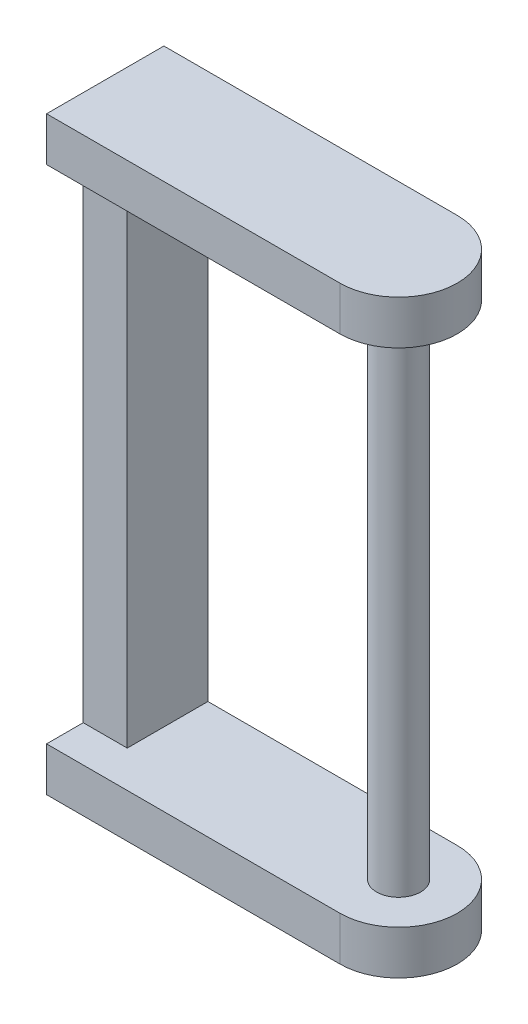
ISO-10303-21;
HEADER;
FILE_DESCRIPTION(('STEP AP214'),'2;1');
FILE_NAME('part.step','',(''),(''),'','','');
FILE_SCHEMA(('AUTOMOTIVE_DESIGN { 1 0 10303 214 1 1 1 1 }'));
ENDSEC;
DATA;
#1=APPLICATION_CONTEXT('core data for automotive mechanical design processes');
#2=APPLICATION_PROTOCOL_DEFINITION('international standard','automotive_design',2000,#1);
#3=PRODUCT_CONTEXT('',#1,'mechanical');
#4=PRODUCT('Part','Part','',(#3));
#5=PRODUCT_RELATED_PRODUCT_CATEGORY('part','',(#4));
#6=PRODUCT_DEFINITION_FORMATION('','',#4);
#7=PRODUCT_DEFINITION_CONTEXT('part definition',#1,'design');
#8=PRODUCT_DEFINITION('design','',#6,#7);
#9=PRODUCT_DEFINITION_SHAPE('','',#8);
#10=(LENGTH_UNIT() NAMED_UNIT(*) SI_UNIT(.MILLI.,.METRE.));
#11=(NAMED_UNIT(*) PLANE_ANGLE_UNIT() SI_UNIT($,.RADIAN.));
#12=(NAMED_UNIT(*) SI_UNIT($,.STERADIAN.) SOLID_ANGLE_UNIT());
#13=UNCERTAINTY_MEASURE_WITH_UNIT(LENGTH_MEASURE(1.E-05),#10,'distance_accuracy_value','');
#14=(GEOMETRIC_REPRESENTATION_CONTEXT(3) GLOBAL_UNCERTAINTY_ASSIGNED_CONTEXT((#13)) GLOBAL_UNIT_ASSIGNED_CONTEXT((#10,
#11,#12)) REPRESENTATION_CONTEXT('',''));
#15=CARTESIAN_POINT('',(0.,0.,0.));
#16=DIRECTION('',(0.,0.,1.));
#17=DIRECTION('',(1.,0.,0.));
#18=AXIS2_PLACEMENT_3D('',#15,#16,#17);
#19=CARTESIAN_POINT('',(-100.,201.,20.));
#20=DIRECTION('',(0.,0.,-1.));
#21=DIRECTION('',(-1.,0.,0.));
#22=AXIS2_PLACEMENT_3D('',#19,#20,#21);
#23=PLANE('',#22);
#24=DIRECTION('',(1.,0.,0.));
#25=VECTOR('',#24,1.);
#26=CARTESIAN_POINT('',(-100.,15.,20.));
#27=LINE('',#26,#25);
#28=CARTESIAN_POINT('',(-100.,15.,20.));
#29=VERTEX_POINT('',#28);
#30=CARTESIAN_POINT('',(0.,15.,20.));
#31=VERTEX_POINT('',#30);
#32=EDGE_CURVE('E151',#29,#31,#27,.T.);
#33=ORIENTED_EDGE('',*,*,#32,.F.);
#34=DIRECTION('',(0.,-1.,0.));
#35=VECTOR('',#34,1.);
#36=CARTESIAN_POINT('',(-100.,201.,20.));
#37=LINE('',#36,#35);
#38=CARTESIAN_POINT('',(-100.,0.,20.));
#39=VERTEX_POINT('',#38);
#40=EDGE_CURVE('E185',#29,#39,#37,.T.);
#41=ORIENTED_EDGE('',*,*,#40,.T.);
#42=DIRECTION('',(1.,0.,0.));
#43=VECTOR('',#42,1.);
#44=CARTESIAN_POINT('',(-100.,0.,20.));
#45=LINE('',#44,#43);
#46=CARTESIAN_POINT('',(0.,0.,20.));
#47=VERTEX_POINT('',#46);
#48=EDGE_CURVE('E168',#39,#47,#45,.T.);
#49=ORIENTED_EDGE('',*,*,#48,.T.);
#50=DIRECTION('',(0.,-1.,0.));
#51=VECTOR('',#50,1.);
#52=CARTESIAN_POINT('',(0.,201.,20.));
#53=LINE('',#52,#51);
#54=EDGE_CURVE('E181',#31,#47,#53,.T.);
#55=ORIENTED_EDGE('',*,*,#54,.F.);
#56=EDGE_LOOP('',(#33,#41,#49,#55));
#57=FACE_BOUND('',#56,.T.);
#58=ADVANCED_FACE('F39',(#57),#23,.F.);
#59=CARTESIAN_POINT('',(-85.,186.,316.861183889036));
#60=DIRECTION('',(1.,0.,0.));
#61=DIRECTION('',(0.,0.,-1.));
#62=AXIS2_PLACEMENT_3D('',#59,#60,#61);
#63=PLANE('',#62);
#64=DIRECTION('',(0.,0.,-1.));
#65=VECTOR('',#64,1.);
#66=CARTESIAN_POINT('',(-85.,186.,316.861183889036));
#67=LINE('',#66,#65);
#68=CARTESIAN_POINT('',(-85.,186.,7.5));
#69=VERTEX_POINT('',#68);
#70=CARTESIAN_POINT('',(-85.,186.,-20.));
#71=VERTEX_POINT('',#70);
#72=EDGE_CURVE('E122',#69,#71,#67,.T.);
#73=ORIENTED_EDGE('',*,*,#72,.F.);
#74=DIRECTION('',(0.,1.,0.));
#75=VECTOR('',#74,1.);
#76=CARTESIAN_POINT('',(-85.,15.,7.5));
#77=LINE('',#76,#75);
#78=CARTESIAN_POINT('',(-85.,15.,7.50000000000001));
#79=VERTEX_POINT('',#78);
#80=EDGE_CURVE('E128',#79,#69,#77,.T.);
#81=ORIENTED_EDGE('',*,*,#80,.F.);
#82=DIRECTION('',(0.,0.,-1.));
#83=VECTOR('',#82,1.);
#84=CARTESIAN_POINT('',(-85.,15.,316.861183889036));
#85=LINE('',#84,#83);
#86=CARTESIAN_POINT('',(-85.,15.,-20.));
#87=VERTEX_POINT('',#86);
#88=EDGE_CURVE('E137',#79,#87,#85,.T.);
#89=ORIENTED_EDGE('',*,*,#88,.T.);
#90=DIRECTION('',(0.,1.,0.));
#91=VECTOR('',#90,1.);
#92=CARTESIAN_POINT('',(-85.,201.,-20.));
#93=LINE('',#92,#91);
#94=EDGE_CURVE('E47',#87,#71,#93,.T.);
#95=ORIENTED_EDGE('',*,*,#94,.T.);
#96=EDGE_LOOP('',(#73,#81,#89,#95));
#97=FACE_BOUND('',#96,.T.);
#98=ADVANCED_FACE('F135',(#97),#63,.T.);
#99=CARTESIAN_POINT('',(-85.,15.,316.861183889036));
#100=DIRECTION('',(0.,1.,0.));
#101=DIRECTION('',(0.,0.,1.));
#102=AXIS2_PLACEMENT_3D('',#99,#100,#101);
#103=PLANE('',#102);
#104=ORIENTED_EDGE('',*,*,#88,.F.);
#105=DIRECTION('',(1.,0.,0.));
#106=VECTOR('',#105,1.);
#107=CARTESIAN_POINT('',(-85.,15.,7.5));
#108=LINE('',#107,#106);
#109=CARTESIAN_POINT('',(-100.,15.,7.5));
#110=VERTEX_POINT('',#109);
#111=EDGE_CURVE('E54',#110,#79,#108,.T.);
#112=ORIENTED_EDGE('',*,*,#111,.F.);
#113=DIRECTION('',(0.,0.,1.));
#114=VECTOR('',#113,1.);
#115=CARTESIAN_POINT('',(-100.,15.,7.5));
#116=LINE('',#115,#114);
#117=EDGE_CURVE('E207',#110,#29,#116,.T.);
#118=ORIENTED_EDGE('',*,*,#117,.T.);
#119=ORIENTED_EDGE('',*,*,#32,.T.);
#120=CARTESIAN_POINT('',(0.,15.,0.));
#121=DIRECTION('',(0.,1.,0.));
#122=DIRECTION('',(0.,0.,1.));
#123=AXIS2_PLACEMENT_3D('',#120,#121,#122);
#124=CIRCLE('',#123,20.);
#125=CARTESIAN_POINT('',(0.,15.,-20.));
#126=VERTEX_POINT('',#125);
#127=EDGE_CURVE('E62',#31,#126,#124,.T.);
#128=ORIENTED_EDGE('',*,*,#127,.T.);
#129=DIRECTION('',(-1.,0.,0.));
#130=VECTOR('',#129,1.);
#131=CARTESIAN_POINT('',(-100.,15.,-20.));
#132=LINE('',#131,#130);
#133=EDGE_CURVE('E11',#126,#87,#132,.T.);
#134=ORIENTED_EDGE('',*,*,#133,.T.);
#135=EDGE_LOOP('',(#104,#112,#118,#119,#128,#134));
#136=FACE_BOUND('',#135,.T.);
#137=CARTESIAN_POINT('',(0.,15.,0.));
#138=DIRECTION('',(0.,1.,0.));
#139=DIRECTION('',(0.,0.,1.));
#140=AXIS2_PLACEMENT_3D('',#137,#138,#139);
#141=CIRCLE('',#140,7.5);
#142=CARTESIAN_POINT('',(0.,15.,7.5));
#143=VERTEX_POINT('',#142);
#144=EDGE_CURVE('E143',#143,#143,#141,.T.);
#145=ORIENTED_EDGE('',*,*,#144,.F.);
#146=EDGE_LOOP('',(#145));
#147=FACE_BOUND('',#146,.T.);
#148=ADVANCED_FACE('F217',(#136,#147),#103,.T.);
#149=CARTESIAN_POINT('',(20.,186.,316.861183889036));
#150=DIRECTION('',(0.,-1.,0.));
#151=DIRECTION('',(0.,0.,-1.));
#152=AXIS2_PLACEMENT_3D('',#149,#150,#151);
#153=PLANE('',#152);
#154=CARTESIAN_POINT('',(0.,186.,0.));
#155=DIRECTION('',(0.,-1.,0.));
#156=DIRECTION('',(0.,0.,-1.));
#157=AXIS2_PLACEMENT_3D('',#154,#155,#156);
#158=CIRCLE('',#157,20.);
#159=CARTESIAN_POINT('',(0.,186.,-20.));
#160=VERTEX_POINT('',#159);
#161=CARTESIAN_POINT('',(0.,186.,20.));
#162=VERTEX_POINT('',#161);
#163=EDGE_CURVE('E140',#160,#162,#158,.T.);
#164=ORIENTED_EDGE('',*,*,#163,.T.);
#165=DIRECTION('',(-1.,0.,0.));
#166=VECTOR('',#165,1.);
#167=CARTESIAN_POINT('',(-100.,186.,20.));
#168=LINE('',#167,#166);
#169=CARTESIAN_POINT('',(-100.,186.,20.));
#170=VERTEX_POINT('',#169);
#171=EDGE_CURVE('E148',#162,#170,#168,.T.);
#172=ORIENTED_EDGE('',*,*,#171,.T.);
#173=DIRECTION('',(0.,0.,1.));
#174=VECTOR('',#173,1.);
#175=CARTESIAN_POINT('',(-100.,186.,7.5));
#176=LINE('',#175,#174);
#177=CARTESIAN_POINT('',(-100.,186.,7.5));
#178=VERTEX_POINT('',#177);
#179=EDGE_CURVE('E125',#178,#170,#176,.T.);
#180=ORIENTED_EDGE('',*,*,#179,.F.);
#181=DIRECTION('',(-1.,0.,0.));
#182=VECTOR('',#181,1.);
#183=CARTESIAN_POINT('',(-85.,186.,7.5));
#184=LINE('',#183,#182);
#185=EDGE_CURVE('E116',#69,#178,#184,.T.);
#186=ORIENTED_EDGE('',*,*,#185,.F.);
#187=ORIENTED_EDGE('',*,*,#72,.T.);
#188=DIRECTION('',(1.,0.,0.));
#189=VECTOR('',#188,1.);
#190=CARTESIAN_POINT('',(-100.,186.,-20.));
#191=LINE('',#190,#189);
#192=EDGE_CURVE('E189',#71,#160,#191,.T.);
#193=ORIENTED_EDGE('',*,*,#192,.T.);
#194=EDGE_LOOP('',(#164,#172,#180,#186,#187,#193));
#195=FACE_BOUND('',#194,.T.);
#196=CARTESIAN_POINT('',(0.,186.,0.));
#197=DIRECTION('',(0.,-1.,0.));
#198=DIRECTION('',(0.,0.,-1.));
#199=AXIS2_PLACEMENT_3D('',#196,#197,#198);
#200=CIRCLE('',#199,7.5);
#201=CARTESIAN_POINT('',(0.,186.,-7.5));
#202=VERTEX_POINT('',#201);
#203=EDGE_CURVE('E138',#202,#202,#200,.T.);
#204=ORIENTED_EDGE('',*,*,#203,.F.);
#205=EDGE_LOOP('',(#204));
#206=FACE_BOUND('',#205,.T.);
#207=ADVANCED_FACE('F118',(#195,#206),#153,.T.);
#208=CARTESIAN_POINT('',(-100.,201.,20.));
#209=VERTEX_POINT('',#208);
#210=EDGE_CURVE('E186',#209,#170,#37,.T.);
#211=ORIENTED_EDGE('',*,*,#210,.T.);
#212=ORIENTED_EDGE('',*,*,#171,.F.);
#213=CARTESIAN_POINT('',(0.,201.,20.));
#214=VERTEX_POINT('',#213);
#215=EDGE_CURVE('E182',#214,#162,#53,.T.);
#216=ORIENTED_EDGE('',*,*,#215,.F.);
#217=DIRECTION('',(1.,0.,0.));
#218=VECTOR('',#217,1.);
#219=CARTESIAN_POINT('',(-100.,201.,20.));
#220=LINE('',#219,#218);
#221=EDGE_CURVE('E158',#209,#214,#220,.T.);
#222=ORIENTED_EDGE('',*,*,#221,.F.);
#223=EDGE_LOOP('',(#211,#212,#216,#222));
#224=FACE_BOUND('',#223,.T.);
#225=ADVANCED_FACE('F201',(#224),#23,.F.);
#226=CARTESIAN_POINT('',(0.,201.,0.));
#227=DIRECTION('',(0.,-1.,0.));
#228=DIRECTION('',(0.,0.,-1.));
#229=AXIS2_PLACEMENT_3D('',#226,#227,#228);
#230=CYLINDRICAL_SURFACE('',#229,20.);
#231=DIRECTION('',(0.,-1.,0.));
#232=VECTOR('',#231,1.);
#233=CARTESIAN_POINT('',(0.,201.,-20.));
#234=LINE('',#233,#232);
#235=CARTESIAN_POINT('',(0.,0.,-20.));
#236=VERTEX_POINT('',#235);
#237=EDGE_CURVE('E177',#126,#236,#234,.T.);
#238=ORIENTED_EDGE('',*,*,#237,.F.);
#239=ORIENTED_EDGE('',*,*,#127,.F.);
#240=ORIENTED_EDGE('',*,*,#54,.T.);
#241=CARTESIAN_POINT('',(0.,0.,0.));
#242=DIRECTION('',(0.,1.,0.));
#243=DIRECTION('',(0.,0.,-1.));
#244=AXIS2_PLACEMENT_3D('',#241,#242,#243);
#245=CIRCLE('',#244,20.);
#246=EDGE_CURVE('E171',#47,#236,#245,.T.);
#247=ORIENTED_EDGE('',*,*,#246,.T.);
#248=EDGE_LOOP('',(#238,#239,#240,#247));
#249=FACE_BOUND('',#248,.T.);
#250=ADVANCED_FACE('F235',(#249),#230,.T.);
#251=ORIENTED_EDGE('',*,*,#163,.F.);
#252=CARTESIAN_POINT('',(0.,201.,-20.));
#253=VERTEX_POINT('',#252);
#254=EDGE_CURVE('E178',#253,#160,#234,.T.);
#255=ORIENTED_EDGE('',*,*,#254,.F.);
#256=CARTESIAN_POINT('',(0.,201.,0.));
#257=DIRECTION('',(0.,1.,0.));
#258=DIRECTION('',(0.,0.,-1.));
#259=AXIS2_PLACEMENT_3D('',#256,#257,#258);
#260=CIRCLE('',#259,20.);
#261=EDGE_CURVE('E161',#214,#253,#260,.T.);
#262=ORIENTED_EDGE('',*,*,#261,.F.);
#263=ORIENTED_EDGE('',*,*,#215,.T.);
#264=EDGE_LOOP('',(#251,#255,#262,#263));
#265=FACE_BOUND('',#264,.T.);
#266=ADVANCED_FACE('F198',(#265),#230,.T.);
#267=CARTESIAN_POINT('',(-100.,201.,-20.));
#268=DIRECTION('',(0.,0.,1.));
#269=DIRECTION('',(1.,0.,0.));
#270=AXIS2_PLACEMENT_3D('',#267,#268,#269);
#271=PLANE('',#270);
#272=ORIENTED_EDGE('',*,*,#133,.F.);
#273=ORIENTED_EDGE('',*,*,#237,.T.);
#274=DIRECTION('',(-1.,0.,0.));
#275=VECTOR('',#274,1.);
#276=CARTESIAN_POINT('',(-100.,0.,-20.));
#277=LINE('',#276,#275);
#278=CARTESIAN_POINT('',(-100.,0.,-20.));
#279=VERTEX_POINT('',#278);
#280=EDGE_CURVE('E159',#236,#279,#277,.T.);
#281=ORIENTED_EDGE('',*,*,#280,.T.);
#282=DIRECTION('',(0.,-1.,0.));
#283=VECTOR('',#282,1.);
#284=CARTESIAN_POINT('',(-100.,201.,-20.));
#285=LINE('',#284,#283);
#286=CARTESIAN_POINT('',(-100.,201.,-20.));
#287=VERTEX_POINT('',#286);
#288=EDGE_CURVE('E165',#287,#279,#285,.T.);
#289=ORIENTED_EDGE('',*,*,#288,.F.);
#290=DIRECTION('',(-1.,0.,0.));
#291=VECTOR('',#290,1.);
#292=CARTESIAN_POINT('',(-100.,201.,-20.));
#293=LINE('',#292,#291);
#294=EDGE_CURVE('E163',#253,#287,#293,.T.);
#295=ORIENTED_EDGE('',*,*,#294,.F.);
#296=ORIENTED_EDGE('',*,*,#254,.T.);
#297=ORIENTED_EDGE('',*,*,#192,.F.);
#298=ORIENTED_EDGE('',*,*,#94,.F.);
#299=EDGE_LOOP('',(#272,#273,#281,#289,#295,#296,#297,#298));
#300=FACE_BOUND('',#299,.T.);
#301=ADVANCED_FACE('F192',(#300),#271,.F.);
#302=CARTESIAN_POINT('',(-100.,201.,-20.));
#303=DIRECTION('',(1.,0.,0.));
#304=DIRECTION('',(0.,0.,-1.));
#305=AXIS2_PLACEMENT_3D('',#302,#303,#304);
#306=PLANE('',#305);
#307=ORIENTED_EDGE('',*,*,#40,.F.);
#308=ORIENTED_EDGE('',*,*,#117,.F.);
#309=DIRECTION('',(0.,-1.,0.));
#310=VECTOR('',#309,1.);
#311=CARTESIAN_POINT('',(-100.,15.,7.5));
#312=LINE('',#311,#310);
#313=EDGE_CURVE('E127',#178,#110,#312,.T.);
#314=ORIENTED_EDGE('',*,*,#313,.F.);
#315=ORIENTED_EDGE('',*,*,#179,.T.);
#316=ORIENTED_EDGE('',*,*,#210,.F.);
#317=DIRECTION('',(0.,0.,1.));
#318=VECTOR('',#317,1.);
#319=CARTESIAN_POINT('',(-100.,201.,-20.));
#320=LINE('',#319,#318);
#321=EDGE_CURVE('E155',#287,#209,#320,.T.);
#322=ORIENTED_EDGE('',*,*,#321,.F.);
#323=ORIENTED_EDGE('',*,*,#288,.T.);
#324=DIRECTION('',(0.,0.,1.));
#325=VECTOR('',#324,1.);
#326=CARTESIAN_POINT('',(-100.,0.,-20.));
#327=LINE('',#326,#325);
#328=EDGE_CURVE('E154',#279,#39,#327,.T.);
#329=ORIENTED_EDGE('',*,*,#328,.T.);
#330=EDGE_LOOP('',(#307,#308,#314,#315,#316,#322,#323,#329));
#331=FACE_BOUND('',#330,.T.);
#332=ADVANCED_FACE('F41',(#331),#306,.F.);
#333=CARTESIAN_POINT('',(0.,201.,0.));
#334=DIRECTION('',(0.,-1.,0.));
#335=DIRECTION('',(0.,0.,-1.));
#336=AXIS2_PLACEMENT_3D('',#333,#334,#335);
#337=PLANE('',#336);
#338=ORIENTED_EDGE('',*,*,#321,.T.);
#339=ORIENTED_EDGE('',*,*,#221,.T.);
#340=ORIENTED_EDGE('',*,*,#261,.T.);
#341=ORIENTED_EDGE('',*,*,#294,.T.);
#342=EDGE_LOOP('',(#338,#339,#340,#341));
#343=FACE_BOUND('',#342,.T.);
#344=ADVANCED_FACE('F248',(#343),#337,.F.);
#345=CARTESIAN_POINT('',(0.,0.,0.));
#346=DIRECTION('',(0.,-1.,0.));
#347=DIRECTION('',(0.,0.,-1.));
#348=AXIS2_PLACEMENT_3D('',#345,#346,#347);
#349=PLANE('',#348);
#350=ORIENTED_EDGE('',*,*,#328,.F.);
#351=ORIENTED_EDGE('',*,*,#280,.F.);
#352=ORIENTED_EDGE('',*,*,#246,.F.);
#353=ORIENTED_EDGE('',*,*,#48,.F.);
#354=EDGE_LOOP('',(#350,#351,#352,#353));
#355=FACE_BOUND('',#354,.T.);
#356=ADVANCED_FACE('F247',(#355),#349,.T.);
#357=CARTESIAN_POINT('',(0.,207.213203435596,0.));
#358=DIRECTION('',(0.,-1.,0.));
#359=DIRECTION('',(0.,0.,-1.));
#360=AXIS2_PLACEMENT_3D('',#357,#358,#359);
#361=CYLINDRICAL_SURFACE('',#360,7.5);
#362=ORIENTED_EDGE('',*,*,#203,.T.);
#363=EDGE_LOOP('',(#362));
#364=FACE_BOUND('',#363,.T.);
#365=ORIENTED_EDGE('',*,*,#144,.T.);
#366=EDGE_LOOP('',(#365));
#367=FACE_BOUND('',#366,.T.);
#368=ADVANCED_FACE('F215',(#364,#367),#361,.T.);
#369=CARTESIAN_POINT('',(0.,0.,7.5));
#370=DIRECTION('',(0.,0.,1.));
#371=DIRECTION('',(1.,0.,0.));
#372=AXIS2_PLACEMENT_3D('',#369,#370,#371);
#373=PLANE('',#372);
#374=ORIENTED_EDGE('',*,*,#80,.T.);
#375=ORIENTED_EDGE('',*,*,#185,.T.);
#376=ORIENTED_EDGE('',*,*,#313,.T.);
#377=ORIENTED_EDGE('',*,*,#111,.T.);
#378=EDGE_LOOP('',(#374,#375,#376,#377));
#379=FACE_BOUND('',#378,.T.);
#380=ADVANCED_FACE('F130',(#379),#373,.T.);
#381=CLOSED_SHELL('',(#58,#98,#148,#207,#225,#250,#266,#301,#332,#344,#356,#368,#380));
#382=MANIFOLD_SOLID_BREP('B2',#381);
#383=ADVANCED_BREP_SHAPE_REPRESENTATION('',(#18,#382),#14);
#384=SHAPE_DEFINITION_REPRESENTATION(#9,#383);
ENDSEC;
END-ISO-10303-21;
